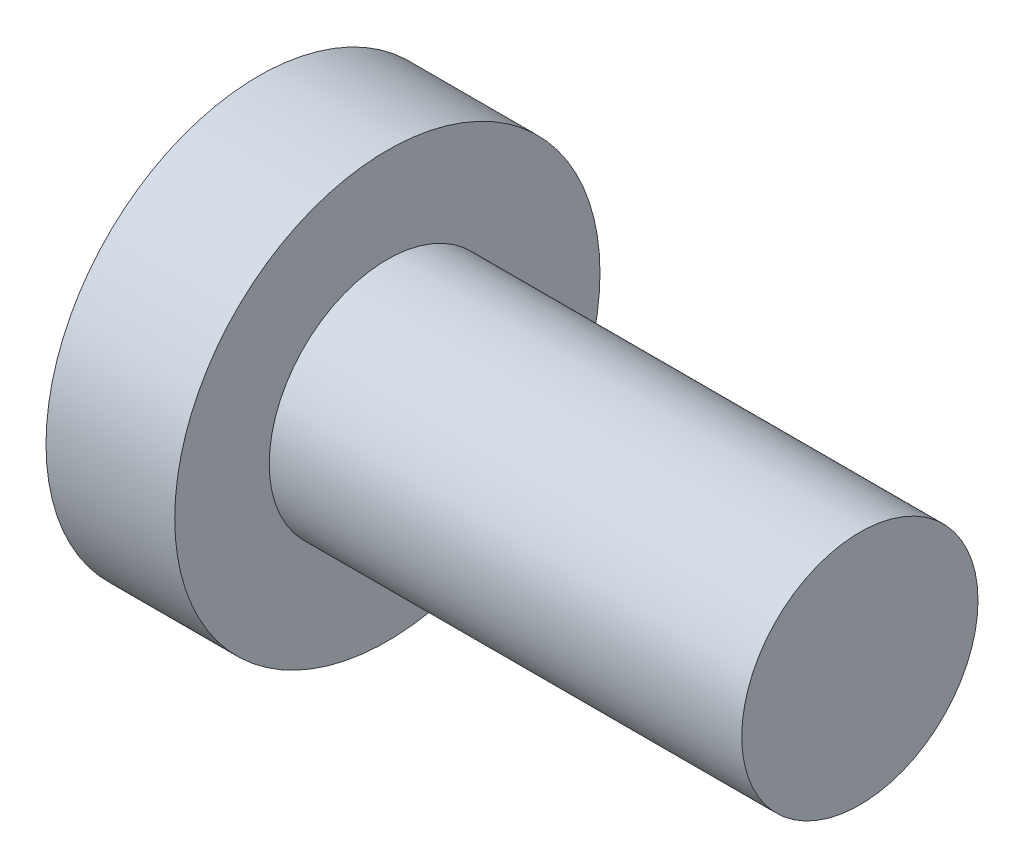
ISO-10303-21;
HEADER;
FILE_DESCRIPTION(('STEP AP214'),'2;1');
FILE_NAME('part.step','',(''),(''),'','','');
FILE_SCHEMA(('AUTOMOTIVE_DESIGN { 1 0 10303 214 1 1 1 1 }'));
ENDSEC;
DATA;
#1=APPLICATION_CONTEXT('core data for automotive mechanical design processes');
#2=APPLICATION_PROTOCOL_DEFINITION('international standard','automotive_design',2000,#1);
#3=PRODUCT_CONTEXT('',#1,'mechanical');
#4=PRODUCT('Part','Part','',(#3));
#5=PRODUCT_RELATED_PRODUCT_CATEGORY('part','',(#4));
#6=PRODUCT_DEFINITION_FORMATION('','',#4);
#7=PRODUCT_DEFINITION_CONTEXT('part definition',#1,'design');
#8=PRODUCT_DEFINITION('design','',#6,#7);
#9=PRODUCT_DEFINITION_SHAPE('','',#8);
#10=(LENGTH_UNIT() NAMED_UNIT(*) SI_UNIT(.MILLI.,.METRE.));
#11=(NAMED_UNIT(*) PLANE_ANGLE_UNIT() SI_UNIT($,.RADIAN.));
#12=(NAMED_UNIT(*) SI_UNIT($,.STERADIAN.) SOLID_ANGLE_UNIT());
#13=UNCERTAINTY_MEASURE_WITH_UNIT(LENGTH_MEASURE(1.E-05),#10,'distance_accuracy_value','');
#14=(GEOMETRIC_REPRESENTATION_CONTEXT(3) GLOBAL_UNCERTAINTY_ASSIGNED_CONTEXT((#13)) GLOBAL_UNIT_ASSIGNED_CONTEXT((#10,
#11,#12)) REPRESENTATION_CONTEXT('',''));
#15=CARTESIAN_POINT('',(0.,0.,0.));
#16=DIRECTION('',(0.,0.,1.));
#17=DIRECTION('',(1.,0.,0.));
#18=AXIS2_PLACEMENT_3D('',#15,#16,#17);
#19=CARTESIAN_POINT('',(0.,0.,1.3));
#20=DIRECTION('',(-0.500000000000001,0.,-0.866025403784438));
#21=DIRECTION('',(-0.866025403784438,0.,0.500000000000001));
#22=AXIS2_PLACEMENT_3D('',#19,#20,#21);
#23=PLANE('',#22);
#24=DIRECTION('',(0.866025403784438,0.,-0.5));
#25=VECTOR('',#24,1.);
#26=CARTESIAN_POINT('',(0.131900023728686,-0.26,1.22384748579412));
#27=LINE('',#26,#25);
#28=CARTESIAN_POINT('',(0.131900023728685,-0.260000000000001,1.22384748579413));
#29=VERTEX_POINT('',#28);
#30=CARTESIAN_POINT('',(1.28171759760097,-0.26,0.56));
#31=VERTEX_POINT('',#30);
#32=EDGE_CURVE('E153',#29,#31,#27,.T.);
#33=ORIENTED_EDGE('',*,*,#32,.F.);
#34=CARTESIAN_POINT('',(0.131900023728686,-0.260000000000001,1.22384748579413));
#35=CARTESIAN_POINT('',(0.128474523226237,-0.173333333333334,1.22582519943132));
#36=CARTESIAN_POINT('',(0.126761772975013,-0.0866666666666675,1.22681405624992));
#37=CARTESIAN_POINT('',(0.126761772975013,0.0866666666666658,1.22681405624992));
#38=CARTESIAN_POINT('',(0.128474523226237,0.173333333333333,1.22582519943132));
#39=CARTESIAN_POINT('',(0.131900023728686,0.259999999999999,1.22384748579413));
#40=B_SPLINE_CURVE_WITH_KNOTS('',3,(#34,#35,#36,#37,#38,#39),.UNSPECIFIED.,.F.,.F.,(4,2,4),(0.,
0.260067687652805,0.520135375305609),.UNSPECIFIED.);
#41=CARTESIAN_POINT('',(0.131900023728685,0.259999999999999,1.22384748579413));
#42=VERTEX_POINT('',#41);
#43=EDGE_CURVE('E137',#29,#42,#40,.T.);
#44=ORIENTED_EDGE('',*,*,#43,.T.);
#45=DIRECTION('',(-0.866025403784438,0.,0.5));
#46=VECTOR('',#45,1.);
#47=CARTESIAN_POINT('',(1.28171759760097,0.26,0.56));
#48=LINE('',#47,#46);
#49=CARTESIAN_POINT('',(1.28171759760097,0.26,0.56));
#50=VERTEX_POINT('',#49);
#51=EDGE_CURVE('E156',#50,#42,#48,.T.);
#52=ORIENTED_EDGE('',*,*,#51,.F.);
#53=CARTESIAN_POINT('',(1.28171759760097,0.56,0.56));
#54=DIRECTION('',(-0.500000000000001,0.,-0.866025403784438));
#55=DIRECTION('',(-0.866025403784438,0.,0.500000000000001));
#56=AXIS2_PLACEMENT_3D('',#53,#54,#55);
#57=ELLIPSE('',#56,0.599999999999999,0.3);
#58=CARTESIAN_POINT('',(1.42,0.270818409307259,0.48016261775073));
#59=VERTEX_POINT('',#58);
#60=EDGE_CURVE('E141',#59,#50,#57,.T.);
#61=ORIENTED_EDGE('',*,*,#60,.F.);
#62=DIRECTION('',(0.,1.,0.));
#63=VECTOR('',#62,1.);
#64=CARTESIAN_POINT('',(1.42,0.26,0.48016261775073));
#65=LINE('',#64,#63);
#66=CARTESIAN_POINT('',(1.42,-0.270818409307259,0.48016261775073));
#67=VERTEX_POINT('',#66);
#68=EDGE_CURVE('E139',#59,#67,#65,.F.);
#69=ORIENTED_EDGE('',*,*,#68,.T.);
#70=CARTESIAN_POINT('',(1.28171759760097,-0.56,0.559999999999999));
#71=DIRECTION('',(-0.500000000000001,0.,-0.866025403784438));
#72=DIRECTION('',(-0.866025403784438,0.,0.500000000000001));
#73=AXIS2_PLACEMENT_3D('',#70,#71,#72);
#74=ELLIPSE('',#73,0.599999999999999,0.3);
#75=EDGE_CURVE('E20',#67,#31,#74,.F.);
#76=ORIENTED_EDGE('',*,*,#75,.T.);
#77=EDGE_LOOP('',(#33,#44,#52,#61,#69,#76));
#78=FACE_BOUND('',#77,.T.);
#79=ADVANCED_FACE('F16',(#78),#23,.T.);
#80=CARTESIAN_POINT('',(0.,-1.3,0.));
#81=DIRECTION('',(-0.500000000000001,0.866025403784438,0.));
#82=DIRECTION('',(-0.866025403784438,-0.500000000000001,0.));
#83=AXIS2_PLACEMENT_3D('',#80,#81,#82);
#84=PLANE('',#83);
#85=DIRECTION('',(0.866025403784439,0.5,0.));
#86=VECTOR('',#85,1.);
#87=CARTESIAN_POINT('',(0.131900023728686,-1.22384748579412,-0.26));
#88=LINE('',#87,#86);
#89=CARTESIAN_POINT('',(0.131900023717085,-1.22384748580082,-0.259999999706629));
#90=VERTEX_POINT('',#89);
#91=CARTESIAN_POINT('',(1.28171759760097,-0.56,-0.26));
#92=VERTEX_POINT('',#91);
#93=EDGE_CURVE('E222',#90,#92,#88,.T.);
#94=ORIENTED_EDGE('',*,*,#93,.F.);
#95=CARTESIAN_POINT('',(0.131900023705483,-1.22384748580752,-0.259999999413259));
#96=CARTESIAN_POINT('',(0.128474523218503,-1.22582519943579,-0.173333332942172));
#97=CARTESIAN_POINT('',(0.126761772975013,-1.22681405624992,-0.0866666664710861));
#98=CARTESIAN_POINT('',(0.126761772975014,-1.22681405624992,0.0866666664710856));
#99=CARTESIAN_POINT('',(0.128474523218504,-1.22582519943579,0.173333332942171));
#100=CARTESIAN_POINT('',(0.131900023705484,-1.22384748580752,0.259999999413257));
#101=B_SPLINE_CURVE_WITH_KNOTS('',3,(#95,#96,#97,#98,#99,#100),.UNSPECIFIED.,.F.,.F.,(4,2,4),
(0.,0.260067687065605,0.520135374131208),.UNSPECIFIED.);
#102=CARTESIAN_POINT('',(0.131900023717085,-1.22384748580082,0.259999999706628));
#103=VERTEX_POINT('',#102);
#104=EDGE_CURVE('E380',#90,#103,#101,.T.);
#105=ORIENTED_EDGE('',*,*,#104,.T.);
#106=DIRECTION('',(-0.866025403784438,-0.5,0.));
#107=VECTOR('',#106,1.);
#108=CARTESIAN_POINT('',(1.28171759760097,-0.56,0.26));
#109=LINE('',#108,#107);
#110=CARTESIAN_POINT('',(1.28171759760097,-0.56,0.26));
#111=VERTEX_POINT('',#110);
#112=EDGE_CURVE('E226',#111,#103,#109,.T.);
#113=ORIENTED_EDGE('',*,*,#112,.F.);
#114=CARTESIAN_POINT('',(1.28171759760097,-0.56,0.559999999999999));
#115=DIRECTION('',(-0.500000000000001,0.866025403784438,0.));
#116=DIRECTION('',(-0.866025403784438,-0.500000000000001,0.));
#117=AXIS2_PLACEMENT_3D('',#114,#115,#116);
#118=ELLIPSE('',#117,0.599999999999999,0.3);
#119=CARTESIAN_POINT('',(1.42,-0.480162617750729,0.270818409307259));
#120=VERTEX_POINT('',#119);
#121=EDGE_CURVE('E152',#120,#111,#118,.T.);
#122=ORIENTED_EDGE('',*,*,#121,.F.);
#123=DIRECTION('',(0.,0.,-1.));
#124=VECTOR('',#123,1.);
#125=CARTESIAN_POINT('',(1.42,-0.480162617750729,0.26));
#126=LINE('',#125,#124);
#127=CARTESIAN_POINT('',(1.42,-0.480162617750729,-0.270818409307259));
#128=VERTEX_POINT('',#127);
#129=EDGE_CURVE('E150',#120,#128,#126,.T.);
#130=ORIENTED_EDGE('',*,*,#129,.T.);
#131=CARTESIAN_POINT('',(1.28171759760097,-0.56,-0.56));
#132=DIRECTION('',(-0.500000000000001,0.866025403784438,0.));
#133=DIRECTION('',(-0.866025403784438,-0.500000000000001,0.));
#134=AXIS2_PLACEMENT_3D('',#131,#132,#133);
#135=ELLIPSE('',#134,0.599999999999999,0.3);
#136=EDGE_CURVE('E370',#128,#92,#135,.F.);
#137=ORIENTED_EDGE('',*,*,#136,.T.);
#138=EDGE_LOOP('',(#94,#105,#113,#122,#130,#137));
#139=FACE_BOUND('',#138,.T.);
#140=ADVANCED_FACE('F384',(#139),#84,.T.);
#141=CARTESIAN_POINT('',(0.,0.,-1.3));
#142=DIRECTION('',(-0.500000000000001,0.,0.866025403784438));
#143=DIRECTION('',(0.866025403784438,0.,0.500000000000001));
#144=AXIS2_PLACEMENT_3D('',#141,#142,#143);
#145=PLANE('',#144);
#146=DIRECTION('',(0.866025403784438,0.,0.5));
#147=VECTOR('',#146,1.);
#148=CARTESIAN_POINT('',(0.131900023728686,0.26,-1.22384748579412));
#149=LINE('',#148,#147);
#150=CARTESIAN_POINT('',(0.131900023728686,0.260000000000001,-1.22384748579413));
#151=VERTEX_POINT('',#150);
#152=CARTESIAN_POINT('',(1.28171759760097,0.26,-0.56));
#153=VERTEX_POINT('',#152);
#154=EDGE_CURVE('E209',#151,#153,#149,.T.);
#155=ORIENTED_EDGE('',*,*,#154,.F.);
#156=CARTESIAN_POINT('',(0.131900023728686,0.260000000000001,-1.22384748579413));
#157=CARTESIAN_POINT('',(0.128474523226237,0.173333333333334,-1.22582519943132));
#158=CARTESIAN_POINT('',(0.126761772975012,0.0866666666666672,-1.22681405624992));
#159=CARTESIAN_POINT('',(0.126761772975013,-0.0866666666666662,-1.22681405624992));
#160=CARTESIAN_POINT('',(0.128474523226237,-0.173333333333333,-1.22582519943133));
#161=CARTESIAN_POINT('',(0.131900023728686,-0.26,-1.22384748579413));
#162=B_SPLINE_CURVE_WITH_KNOTS('',3,(#156,#157,#158,#159,#160,#161),.UNSPECIFIED.,.F.,.F.,(4,2,
4),(0.,0.260067687652805,0.520135375305609),.UNSPECIFIED.);
#163=CARTESIAN_POINT('',(0.131900023728687,-0.26,-1.22384748579413));
#164=VERTEX_POINT('',#163);
#165=EDGE_CURVE('E163',#151,#164,#162,.T.);
#166=ORIENTED_EDGE('',*,*,#165,.T.);
#167=DIRECTION('',(-0.866025403784438,0.,-0.5));
#168=VECTOR('',#167,1.);
#169=CARTESIAN_POINT('',(1.28171759760097,-0.26,-0.56));
#170=LINE('',#169,#168);
#171=CARTESIAN_POINT('',(1.28171759760097,-0.26,-0.56));
#172=VERTEX_POINT('',#171);
#173=EDGE_CURVE('E212',#172,#164,#170,.T.);
#174=ORIENTED_EDGE('',*,*,#173,.F.);
#175=CARTESIAN_POINT('',(1.28171759760097,-0.56,-0.56));
#176=DIRECTION('',(-0.500000000000001,0.,0.866025403784438));
#177=DIRECTION('',(-0.866025403784438,0.,-0.500000000000001));
#178=AXIS2_PLACEMENT_3D('',#175,#176,#177);
#179=ELLIPSE('',#178,0.599999999999999,0.3);
#180=CARTESIAN_POINT('',(1.42,-0.270818409307259,-0.48016261775073));
#181=VERTEX_POINT('',#180);
#182=EDGE_CURVE('E221',#181,#172,#179,.T.);
#183=ORIENTED_EDGE('',*,*,#182,.F.);
#184=DIRECTION('',(0.,1.,0.));
#185=VECTOR('',#184,1.);
#186=CARTESIAN_POINT('',(1.42,0.26,-0.48016261775073));
#187=LINE('',#186,#185);
#188=CARTESIAN_POINT('',(1.42,0.270818409307259,-0.48016261775073));
#189=VERTEX_POINT('',#188);
#190=EDGE_CURVE('E145',#181,#189,#187,.T.);
#191=ORIENTED_EDGE('',*,*,#190,.T.);
#192=CARTESIAN_POINT('',(1.28171759760097,0.56,-0.56));
#193=DIRECTION('',(-0.500000000000001,0.,0.866025403784438));
#194=DIRECTION('',(-0.866025403784438,0.,-0.500000000000001));
#195=AXIS2_PLACEMENT_3D('',#192,#193,#194);
#196=ELLIPSE('',#195,0.599999999999999,0.3);
#197=EDGE_CURVE('E171',#189,#153,#196,.F.);
#198=ORIENTED_EDGE('',*,*,#197,.T.);
#199=EDGE_LOOP('',(#155,#166,#174,#183,#191,#198));
#200=FACE_BOUND('',#199,.T.);
#201=ADVANCED_FACE('F173',(#200),#145,.T.);
#202=CARTESIAN_POINT('',(1.42,0.26,0.26));
#203=DIRECTION('',(1.,0.,0.));
#204=DIRECTION('',(0.,0.,-1.));
#205=AXIS2_PLACEMENT_3D('',#202,#203,#204);
#206=PLANE('',#205);
#207=CARTESIAN_POINT('',(1.42,0.56,0.56));
#208=DIRECTION('',(-1.,0.,0.));
#209=DIRECTION('',(0.,0.,1.));
#210=AXIS2_PLACEMENT_3D('',#207,#208,#209);
#211=CIRCLE('',#210,0.3);
#212=CARTESIAN_POINT('',(1.42,0.480162617750729,0.270818409307259));
#213=VERTEX_POINT('',#212);
#214=EDGE_CURVE('E144',#213,#59,#211,.T.);
#215=ORIENTED_EDGE('',*,*,#214,.F.);
#216=DIRECTION('',(0.,0.,1.));
#217=VECTOR('',#216,1.);
#218=CARTESIAN_POINT('',(1.42,0.480162617750729,0.));
#219=LINE('',#218,#217);
#220=CARTESIAN_POINT('',(1.42,0.480162617750729,-0.270818409307259));
#221=VERTEX_POINT('',#220);
#222=EDGE_CURVE('E198',#221,#213,#219,.T.);
#223=ORIENTED_EDGE('',*,*,#222,.F.);
#224=CARTESIAN_POINT('',(1.42,0.56,-0.56));
#225=DIRECTION('',(-1.,0.,0.));
#226=DIRECTION('',(0.,0.,1.));
#227=AXIS2_PLACEMENT_3D('',#224,#225,#226);
#228=CIRCLE('',#227,0.3);
#229=EDGE_CURVE('E208',#189,#221,#228,.T.);
#230=ORIENTED_EDGE('',*,*,#229,.F.);
#231=ORIENTED_EDGE('',*,*,#190,.F.);
#232=CARTESIAN_POINT('',(1.42,-0.56,-0.56));
#233=DIRECTION('',(-1.,0.,0.));
#234=DIRECTION('',(0.,0.,1.));
#235=AXIS2_PLACEMENT_3D('',#232,#233,#234);
#236=CIRCLE('',#235,0.3);
#237=EDGE_CURVE('E225',#128,#181,#236,.T.);
#238=ORIENTED_EDGE('',*,*,#237,.F.);
#239=ORIENTED_EDGE('',*,*,#129,.F.);
#240=CARTESIAN_POINT('',(1.42,-0.56,0.559999999999999));
#241=DIRECTION('',(-1.,0.,0.));
#242=DIRECTION('',(0.,0.,1.));
#243=AXIS2_PLACEMENT_3D('',#240,#241,#242);
#244=CIRCLE('',#243,0.3);
#245=EDGE_CURVE('E131',#67,#120,#244,.T.);
#246=ORIENTED_EDGE('',*,*,#245,.F.);
#247=ORIENTED_EDGE('',*,*,#68,.F.);
#248=EDGE_LOOP('',(#215,#223,#230,#231,#238,#239,#246,#247));
#249=FACE_BOUND('',#248,.T.);
#250=ADVANCED_FACE('F147',(#249),#206,.F.);
#251=CARTESIAN_POINT('',(1.42,0.26,0.26));
#252=DIRECTION('',(0.,0.,-1.));
#253=DIRECTION('',(0.,1.,0.));
#254=AXIS2_PLACEMENT_3D('',#251,#252,#253);
#255=PLANE('',#254);
#256=DIRECTION('',(-1.,0.,0.));
#257=VECTOR('',#256,1.);
#258=CARTESIAN_POINT('',(1.42,0.56,0.26));
#259=LINE('',#258,#257);
#260=CARTESIAN_POINT('',(0.0318512082891233,0.56,0.26));
#261=VERTEX_POINT('',#260);
#262=CARTESIAN_POINT('',(1.28171759760097,0.56,0.26));
#263=VERTEX_POINT('',#262);
#264=EDGE_CURVE('E161',#261,#263,#259,.F.);
#265=ORIENTED_EDGE('',*,*,#264,.F.);
#266=CARTESIAN_POINT('',(0.131900023728999,1.22384748579563,0.26));
#267=CARTESIAN_POINT('',(0.109024671869535,1.11414072631645,0.26));
#268=CARTESIAN_POINT('',(0.0892495946531461,1.00396672276055,0.26));
#269=CARTESIAN_POINT('',(0.0558999895065205,0.782684227495345,0.26));
#270=CARTESIAN_POINT('',(0.0423254615762836,0.671575735786029,0.26));
#271=CARTESIAN_POINT('',(0.0318512082891225,0.56,0.26));
#272=B_SPLINE_CURVE_WITH_KNOTS('',3,(#266,#267,#268,#269,#270,#271),.UNSPECIFIED.,.F.,.F.,(4,2,
4),(0.,0.335803934828096,0.671607869656192),.UNSPECIFIED.);
#273=CARTESIAN_POINT('',(0.131900023728843,1.22384748579488,0.26));
#274=VERTEX_POINT('',#273);
#275=EDGE_CURVE('E196',#274,#261,#272,.T.);
#276=ORIENTED_EDGE('',*,*,#275,.F.);
#277=DIRECTION('',(0.866025403784438,-0.500000000000001,0.));
#278=VECTOR('',#277,1.);
#279=CARTESIAN_POINT('',(0.,1.3,0.26));
#280=LINE('',#279,#278);
#281=EDGE_CURVE('E193',#263,#274,#280,.F.);
#282=ORIENTED_EDGE('',*,*,#281,.F.);
#283=EDGE_LOOP('',(#265,#276,#282));
#284=FACE_BOUND('',#283,.T.);
#285=ADVANCED_FACE('F343',(#284),#255,.T.);
#286=CARTESIAN_POINT('',(1.42,0.56,0.56));
#287=DIRECTION('',(-1.,0.,0.));
#288=DIRECTION('',(0.,0.,1.));
#289=AXIS2_PLACEMENT_3D('',#286,#287,#288);
#290=CYLINDRICAL_SURFACE('',#289,0.3);
#291=ORIENTED_EDGE('',*,*,#264,.T.);
#292=CARTESIAN_POINT('',(1.28171759760097,0.56,0.56));
#293=DIRECTION('',(-0.500000000000001,-0.866025403784438,0.));
#294=DIRECTION('',(-0.866025403784438,0.500000000000001,0.));
#295=AXIS2_PLACEMENT_3D('',#292,#293,#294);
#296=ELLIPSE('',#295,0.599999999999999,0.3);
#297=EDGE_CURVE('E197',#213,#263,#296,.F.);
#298=ORIENTED_EDGE('',*,*,#297,.F.);
#299=ORIENTED_EDGE('',*,*,#214,.T.);
#300=ORIENTED_EDGE('',*,*,#60,.T.);
#301=DIRECTION('',(1.,0.,0.));
#302=VECTOR('',#301,1.);
#303=CARTESIAN_POINT('',(1.42,0.26,0.56));
#304=LINE('',#303,#302);
#305=CARTESIAN_POINT('',(0.0318512082891228,0.26,0.56));
#306=VERTEX_POINT('',#305);
#307=EDGE_CURVE('E235',#306,#50,#304,.T.);
#308=ORIENTED_EDGE('',*,*,#307,.F.);
#309=CARTESIAN_POINT('',(0.0318512082891225,0.56,0.26));
#310=CARTESIAN_POINT('',(0.0302763429254548,0.543230502681691,0.259985437714721));
#311=CARTESIAN_POINT('',(0.0288356986059309,0.526450523314333,0.261405308271578));
#312=CARTESIAN_POINT('',(0.0262583139029484,0.493346825657173,0.267021001154307));
#313=CARTESIAN_POINT('',(0.0251214084487592,0.477022863876044,0.271215311349898));
#314=CARTESIAN_POINT('',(0.0231845218660754,0.445278479801574,0.282290873833725));
#315=CARTESIAN_POINT('',(0.0223847676736678,0.429858672084473,0.289173929928476));
#316=CARTESIAN_POINT('',(0.0211465173921949,0.400382770095474,0.305431001307788));
#317=CARTESIAN_POINT('',(0.0207079245575508,0.386326311509045,0.314804348618755));
#318=CARTESIAN_POINT('',(0.0202059114511675,0.36004075309326,0.335729534202575));
#319=CARTESIAN_POINT('',(0.0201407552432185,0.347803456016402,0.347271034522211));
#320=CARTESIAN_POINT('',(0.0203828825863919,0.325427901409002,0.372232049117524));
#321=CARTESIAN_POINT('',(0.0206901591607611,0.315289604562224,0.38565152820901));
#322=CARTESIAN_POINT('',(0.0216670469531175,0.297415154250282,0.413955683439772));
#323=CARTESIAN_POINT('',(0.0223359776383337,0.289674531920633,0.428837564843834));
#324=CARTESIAN_POINT('',(0.0240164089167484,0.276784108973221,0.459663052830639));
#325=CARTESIAN_POINT('',(0.0250277553585772,0.271633145111392,0.475606179063786));
#326=CARTESIAN_POINT('',(0.0269984817654867,0.265235606144538,0.503026452257885));
#327=CARTESIAN_POINT('',(0.0278759321019495,0.263272642846243,0.514347905971935));
#328=CARTESIAN_POINT('',(0.0297654658761743,0.260654830519488,0.537113472785311));
#329=CARTESIAN_POINT('',(0.0307773551688136,0.2599981165591,0.54855738752774));
#330=CARTESIAN_POINT('',(0.0318512082891224,0.259999999999999,0.56));
#331=B_SPLINE_CURVE_WITH_KNOTS('',3,(#309,#310,#311,#312,#313,#314,#315,#316,#317,#318,#319,
#320,#321,#322,#323,#324,#325,#326,#327,#328,#329,#330),.UNSPECIFIED.,.F.,.F.,(4,2,2,2,2,2,2,2,
2,2,4),(0.,0.0504666310904526,0.10090577940126,0.151378824240234,0.201838344282696,
0.252063109630029,0.302286934135435,0.35241657860075,0.402523685256848,0.43702381806311,
0.471474659580351),.UNSPECIFIED.);
#332=EDGE_CURVE('E347',#261,#306,#331,.T.);
#333=ORIENTED_EDGE('',*,*,#332,.F.);
#334=EDGE_LOOP('',(#291,#298,#299,#300,#308,#333));
#335=FACE_BOUND('',#334,.T.);
#336=ADVANCED_FACE('F338',(#335),#290,.T.);
#337=CARTESIAN_POINT('',(1.42,0.26,0.26));
#338=DIRECTION('',(0.,-1.,0.));
#339=DIRECTION('',(0.,0.,-1.));
#340=AXIS2_PLACEMENT_3D('',#337,#338,#339);
#341=PLANE('',#340);
#342=ORIENTED_EDGE('',*,*,#307,.T.);
#343=ORIENTED_EDGE('',*,*,#51,.T.);
#344=CARTESIAN_POINT('',(6.,0.260000000000001,0.));
#345=DIRECTION('',(0.,1.,0.));
#346=DIRECTION('',(0.,0.,1.));
#347=AXIS2_PLACEMENT_3D('',#344,#345,#346);
#348=CIRCLE('',#347,5.99436401964379);
#349=EDGE_CURVE('E355',#306,#42,#348,.T.);
#350=ORIENTED_EDGE('',*,*,#349,.F.);
#351=EDGE_LOOP('',(#342,#343,#350));
#352=FACE_BOUND('',#351,.T.);
#353=ADVANCED_FACE('F334',(#352),#341,.T.);
#354=CARTESIAN_POINT('',(1.42,-0.26,0.26));
#355=DIRECTION('',(0.,1.,0.));
#356=DIRECTION('',(0.,0.,1.));
#357=AXIS2_PLACEMENT_3D('',#354,#355,#356);
#358=PLANE('',#357);
#359=DIRECTION('',(-1.,0.,0.));
#360=VECTOR('',#359,1.);
#361=CARTESIAN_POINT('',(1.42,-0.26,0.56));
#362=LINE('',#361,#360);
#363=CARTESIAN_POINT('',(0.0318512082891224,-0.26,0.56));
#364=VERTEX_POINT('',#363);
#365=EDGE_CURVE('E133',#364,#31,#362,.F.);
#366=ORIENTED_EDGE('',*,*,#365,.F.);
#367=CARTESIAN_POINT('',(6.,-0.260000000000001,0.));
#368=DIRECTION('',(0.,1.,0.));
#369=DIRECTION('',(0.,0.,1.));
#370=AXIS2_PLACEMENT_3D('',#367,#368,#369);
#371=CIRCLE('',#370,5.99436401964379);
#372=EDGE_CURVE('E611',#29,#364,#371,.F.);
#373=ORIENTED_EDGE('',*,*,#372,.F.);
#374=ORIENTED_EDGE('',*,*,#32,.T.);
#375=EDGE_LOOP('',(#366,#373,#374));
#376=FACE_BOUND('',#375,.T.);
#377=ADVANCED_FACE('F331',(#376),#358,.T.);
#378=CARTESIAN_POINT('',(1.42,-0.56,0.559999999999999));
#379=DIRECTION('',(-1.,0.,0.));
#380=DIRECTION('',(0.,0.,1.));
#381=AXIS2_PLACEMENT_3D('',#378,#379,#380);
#382=CYLINDRICAL_SURFACE('',#381,0.3);
#383=ORIENTED_EDGE('',*,*,#365,.T.);
#384=ORIENTED_EDGE('',*,*,#75,.F.);
#385=ORIENTED_EDGE('',*,*,#245,.T.);
#386=ORIENTED_EDGE('',*,*,#121,.T.);
#387=DIRECTION('',(1.,0.,0.));
#388=VECTOR('',#387,1.);
#389=CARTESIAN_POINT('',(1.42,-0.56,0.26));
#390=LINE('',#389,#388);
#391=CARTESIAN_POINT('',(0.0318512082891233,-0.56,0.26));
#392=VERTEX_POINT('',#391);
#393=EDGE_CURVE('E229',#392,#111,#390,.T.);
#394=ORIENTED_EDGE('',*,*,#393,.F.);
#395=CARTESIAN_POINT('',(0.0318512082891224,-0.259999999999999,0.56));
#396=CARTESIAN_POINT('',(0.0302763429254535,-0.259985437714721,0.54323050268169));
#397=CARTESIAN_POINT('',(0.0288356986059302,-0.261405308271578,0.526450523314333));
#398=CARTESIAN_POINT('',(0.0262583139029492,-0.267021001154307,0.493346825657173));
#399=CARTESIAN_POINT('',(0.0251214084487609,-0.271215311349898,0.477022863876044));
#400=CARTESIAN_POINT('',(0.0231845218660765,-0.282290873833725,0.445278479801575));
#401=CARTESIAN_POINT('',(0.0223847676736673,-0.289173929928476,0.429858672084474));
#402=CARTESIAN_POINT('',(0.0211465173921935,-0.305431001307788,0.400382770095475));
#403=CARTESIAN_POINT('',(0.0207079245575501,-0.314804348618754,0.386326311509045));
#404=CARTESIAN_POINT('',(0.020205911451168,-0.335729534202574,0.36004075309326));
#405=CARTESIAN_POINT('',(0.0201407552432196,-0.347271034522211,0.347803456016403));
#406=CARTESIAN_POINT('',(0.0203828825863926,-0.372232049117523,0.325427901409003));
#407=CARTESIAN_POINT('',(0.020690159160761,-0.385651528209009,0.315289604562225));
#408=CARTESIAN_POINT('',(0.0216670469531166,-0.413955683439771,0.297415154250282));
#409=CARTESIAN_POINT('',(0.0223359776383329,-0.428837564843833,0.289674531920634));
#410=CARTESIAN_POINT('',(0.0240164089167474,-0.459663052830637,0.276784108973221));
#411=CARTESIAN_POINT('',(0.0250277553585759,-0.475606179063785,0.271633145111392));
#412=CARTESIAN_POINT('',(0.0269984817654858,-0.503026452257883,0.265235606144538));
#413=CARTESIAN_POINT('',(0.0278759321019491,-0.514347905971934,0.263272642846243));
#414=CARTESIAN_POINT('',(0.0297654658761745,-0.53711347278531,0.260654830519488));
#415=CARTESIAN_POINT('',(0.030777355168814,-0.54855738752774,0.2599981165591));
#416=CARTESIAN_POINT('',(0.0318512082891225,-0.560000000000001,0.26));
#417=B_SPLINE_CURVE_WITH_KNOTS('',3,(#395,#396,#397,#398,#399,#400,#401,#402,#403,#404,#405,
#406,#407,#408,#409,#410,#411,#412,#413,#414,#415,#416),.UNSPECIFIED.,.F.,.F.,(4,2,2,2,2,2,2,2,
2,2,4),(0.,0.0504666310904519,0.100905779401259,0.151378824240232,0.201838344282695,
0.252063109630027,0.302286934135432,0.352416578600748,0.402523685256845,0.437023818063109,
0.471474659580351),.UNSPECIFIED.);
#418=EDGE_CURVE('E317',#364,#392,#417,.T.);
#419=ORIENTED_EDGE('',*,*,#418,.F.);
#420=EDGE_LOOP('',(#383,#384,#385,#386,#394,#419));
#421=FACE_BOUND('',#420,.T.);
#422=ADVANCED_FACE('F129',(#421),#382,.T.);
#423=CARTESIAN_POINT('',(1.42,-0.26,0.26));
#424=DIRECTION('',(0.,0.,-1.));
#425=DIRECTION('',(0.,1.,0.));
#426=AXIS2_PLACEMENT_3D('',#423,#424,#425);
#427=PLANE('',#426);
#428=ORIENTED_EDGE('',*,*,#393,.T.);
#429=ORIENTED_EDGE('',*,*,#112,.T.);
#430=CARTESIAN_POINT('',(0.0318512082891225,-0.560000000000001,0.26));
#431=CARTESIAN_POINT('',(0.0423254615762838,-0.671575735786029,0.26));
#432=CARTESIAN_POINT('',(0.0558999895065207,-0.782684227495345,0.26));
#433=CARTESIAN_POINT('',(0.089249594653146,-1.00396672276055,0.26));
#434=CARTESIAN_POINT('',(0.109024671869534,-1.11414072631645,0.26));
#435=CARTESIAN_POINT('',(0.131900023728998,-1.22384748579563,0.26));
#436=B_SPLINE_CURVE_WITH_KNOTS('',3,(#430,#431,#432,#433,#434,#435),.UNSPECIFIED.,.F.,.F.,(4,2,
4),(0.,0.335803934828095,0.67160786965619),.UNSPECIFIED.);
#437=EDGE_CURVE('E310',#392,#103,#436,.T.);
#438=ORIENTED_EDGE('',*,*,#437,.F.);
#439=EDGE_LOOP('',(#428,#429,#438));
#440=FACE_BOUND('',#439,.T.);
#441=ADVANCED_FACE('F324',(#440),#427,.T.);
#442=CARTESIAN_POINT('',(1.42,-0.26,-0.26));
#443=DIRECTION('',(0.,0.,1.));
#444=DIRECTION('',(1.,0.,0.));
#445=AXIS2_PLACEMENT_3D('',#442,#443,#444);
#446=PLANE('',#445);
#447=DIRECTION('',(-1.,0.,0.));
#448=VECTOR('',#447,1.);
#449=CARTESIAN_POINT('',(1.42,-0.56,-0.26));
#450=LINE('',#449,#448);
#451=CARTESIAN_POINT('',(0.0318512082891236,-0.56,-0.260000000000002));
#452=VERTEX_POINT('',#451);
#453=EDGE_CURVE('E218',#452,#92,#450,.F.);
#454=ORIENTED_EDGE('',*,*,#453,.F.);
#455=CARTESIAN_POINT('',(0.131900023728999,-1.22384748579563,-0.260000000000001));
#456=CARTESIAN_POINT('',(0.109024671869535,-1.11414072631645,-0.260000000000001));
#457=CARTESIAN_POINT('',(0.089249594653146,-1.00396672276055,-0.26));
#458=CARTESIAN_POINT('',(0.0558999895065207,-0.782684227495345,-0.26));
#459=CARTESIAN_POINT('',(0.042325461576284,-0.671575735786029,-0.260000000000001));
#460=CARTESIAN_POINT('',(0.0318512082891232,-0.560000000000001,-0.260000000000002));
#461=B_SPLINE_CURVE_WITH_KNOTS('',3,(#455,#456,#457,#458,#459,#460),.UNSPECIFIED.,.F.,.F.,(4,2,
4),(0.,0.335803934828095,0.67160786965619),.UNSPECIFIED.);
#462=EDGE_CURVE('E303',#90,#452,#461,.T.);
#463=ORIENTED_EDGE('',*,*,#462,.F.);
#464=ORIENTED_EDGE('',*,*,#93,.T.);
#465=EDGE_LOOP('',(#454,#463,#464));
#466=FACE_BOUND('',#465,.T.);
#467=ADVANCED_FACE('F289',(#466),#446,.T.);
#468=CARTESIAN_POINT('',(1.42,-0.56,-0.56));
#469=DIRECTION('',(-1.,0.,0.));
#470=DIRECTION('',(0.,0.,1.));
#471=AXIS2_PLACEMENT_3D('',#468,#469,#470);
#472=CYLINDRICAL_SURFACE('',#471,0.3);
#473=ORIENTED_EDGE('',*,*,#453,.T.);
#474=ORIENTED_EDGE('',*,*,#136,.F.);
#475=ORIENTED_EDGE('',*,*,#237,.T.);
#476=ORIENTED_EDGE('',*,*,#182,.T.);
#477=DIRECTION('',(1.,0.,0.));
#478=VECTOR('',#477,1.);
#479=CARTESIAN_POINT('',(1.42,-0.26,-0.56));
#480=LINE('',#479,#478);
#481=CARTESIAN_POINT('',(0.0318512082891241,-0.26,-0.56));
#482=VERTEX_POINT('',#481);
#483=EDGE_CURVE('E215',#482,#172,#480,.T.);
#484=ORIENTED_EDGE('',*,*,#483,.F.);
#485=CARTESIAN_POINT('',(0.0318512082891232,-0.560000000000001,-0.260000000000003));
#486=CARTESIAN_POINT('',(0.0302763429254549,-0.543230502681691,-0.259985437714722));
#487=CARTESIAN_POINT('',(0.0288356986059309,-0.526450523314333,-0.261405308271578));
#488=CARTESIAN_POINT('',(0.0262583139029484,-0.493346825657173,-0.267021001154307));
#489=CARTESIAN_POINT('',(0.0251214084487592,-0.477022863876044,-0.271215311349899));
#490=CARTESIAN_POINT('',(0.0231845218660753,-0.445278479801574,-0.282290873833725));
#491=CARTESIAN_POINT('',(0.0223847676736677,-0.429858672084472,-0.289173929928477));
#492=CARTESIAN_POINT('',(0.0211465173921947,-0.400382770095473,-0.305431001307789));
#493=CARTESIAN_POINT('',(0.0207079245575508,-0.386326311509044,-0.314804348618757));
#494=CARTESIAN_POINT('',(0.0202059114511675,-0.360040753093259,-0.335729534202578));
#495=CARTESIAN_POINT('',(0.0201407552432185,-0.347803456016401,-0.347271034522214));
#496=CARTESIAN_POINT('',(0.0203828825863919,-0.325427901409001,-0.372232049117525));
#497=CARTESIAN_POINT('',(0.0206901591607611,-0.315289604562223,-0.385651528209011));
#498=CARTESIAN_POINT('',(0.0216670469531175,-0.297415154250281,-0.413955683439772));
#499=CARTESIAN_POINT('',(0.0223359776383337,-0.289674531920633,-0.428837564843835));
#500=CARTESIAN_POINT('',(0.0240164089167485,-0.276784108973221,-0.459663052830639));
#501=CARTESIAN_POINT('',(0.0250277553585773,-0.271633145111392,-0.475606179063787));
#502=CARTESIAN_POINT('',(0.0269984817654867,-0.265235606144538,-0.503026452257886));
#503=CARTESIAN_POINT('',(0.0278759321019494,-0.263272642846243,-0.514347905971937));
#504=CARTESIAN_POINT('',(0.0297654658761742,-0.260654830519488,-0.537113472785313));
#505=CARTESIAN_POINT('',(0.0307773551688137,-0.2599981165591,-0.548557387527743));
#506=CARTESIAN_POINT('',(0.0318512082891231,-0.26,-0.560000000000003));
#507=B_SPLINE_CURVE_WITH_KNOTS('',3,(#485,#486,#487,#488,#489,#490,#491,#492,#493,#494,#495,
#496,#497,#498,#499,#500,#501,#502,#503,#504,#505,#506),.UNSPECIFIED.,.F.,.F.,(4,2,2,2,2,2,2,2,
2,2,4),(0.,0.050466631090453,0.10090577940126,0.151378824240235,0.201838344282699,
0.252063109630031,0.302286934135435,0.35241657860075,0.402523685256848,0.437023818063112,
0.471474659580354),.UNSPECIFIED.);
#508=EDGE_CURVE('E294',#452,#482,#507,.T.);
#509=ORIENTED_EDGE('',*,*,#508,.F.);
#510=EDGE_LOOP('',(#473,#474,#475,#476,#484,#509));
#511=FACE_BOUND('',#510,.T.);
#512=ADVANCED_FACE('F284',(#511),#472,.T.);
#513=CARTESIAN_POINT('',(1.42,-0.26,-0.26));
#514=DIRECTION('',(0.,1.,0.));
#515=DIRECTION('',(0.,0.,1.));
#516=AXIS2_PLACEMENT_3D('',#513,#514,#515);
#517=PLANE('',#516);
#518=ORIENTED_EDGE('',*,*,#483,.T.);
#519=ORIENTED_EDGE('',*,*,#173,.T.);
#520=CARTESIAN_POINT('',(6.,-0.26,0.));
#521=DIRECTION('',(0.,1.,0.));
#522=DIRECTION('',(0.,0.,1.));
#523=AXIS2_PLACEMENT_3D('',#520,#521,#522);
#524=CIRCLE('',#523,5.99436401964379);
#525=EDGE_CURVE('E302',#482,#164,#524,.F.);
#526=ORIENTED_EDGE('',*,*,#525,.F.);
#527=EDGE_LOOP('',(#518,#519,#526));
#528=FACE_BOUND('',#527,.T.);
#529=ADVANCED_FACE('F280',(#528),#517,.T.);
#530=CARTESIAN_POINT('',(1.42,0.26,-0.26));
#531=DIRECTION('',(0.,-1.,0.));
#532=DIRECTION('',(0.,0.,-1.));
#533=AXIS2_PLACEMENT_3D('',#530,#531,#532);
#534=PLANE('',#533);
#535=DIRECTION('',(-1.,0.,0.));
#536=VECTOR('',#535,1.);
#537=CARTESIAN_POINT('',(1.42,0.26,-0.56));
#538=LINE('',#537,#536);
#539=CARTESIAN_POINT('',(0.0318512082891236,0.26,-0.560000000000002));
#540=VERTEX_POINT('',#539);
#541=EDGE_CURVE('E205',#540,#153,#538,.F.);
#542=ORIENTED_EDGE('',*,*,#541,.F.);
#543=CARTESIAN_POINT('',(6.,0.260000000000001,0.));
#544=DIRECTION('',(0.,1.,0.));
#545=DIRECTION('',(0.,0.,1.));
#546=AXIS2_PLACEMENT_3D('',#543,#544,#545);
#547=CIRCLE('',#546,5.99436401964379);
#548=EDGE_CURVE('E610',#151,#540,#547,.T.);
#549=ORIENTED_EDGE('',*,*,#548,.F.);
#550=ORIENTED_EDGE('',*,*,#154,.T.);
#551=EDGE_LOOP('',(#542,#549,#550));
#552=FACE_BOUND('',#551,.T.);
#553=ADVANCED_FACE('F276',(#552),#534,.T.);
#554=CARTESIAN_POINT('',(1.42,0.56,-0.56));
#555=DIRECTION('',(-1.,0.,0.));
#556=DIRECTION('',(0.,0.,1.));
#557=AXIS2_PLACEMENT_3D('',#554,#555,#556);
#558=CYLINDRICAL_SURFACE('',#557,0.3);
#559=ORIENTED_EDGE('',*,*,#541,.T.);
#560=ORIENTED_EDGE('',*,*,#197,.F.);
#561=ORIENTED_EDGE('',*,*,#229,.T.);
#562=CARTESIAN_POINT('',(1.28171759760097,0.56,-0.56));
#563=DIRECTION('',(-0.500000000000001,-0.866025403784438,0.));
#564=DIRECTION('',(-0.866025403784438,0.500000000000001,0.));
#565=AXIS2_PLACEMENT_3D('',#562,#563,#564);
#566=ELLIPSE('',#565,0.599999999999999,0.3);
#567=CARTESIAN_POINT('',(1.28171759760097,0.56,-0.26));
#568=VERTEX_POINT('',#567);
#569=EDGE_CURVE('E201',#568,#221,#566,.F.);
#570=ORIENTED_EDGE('',*,*,#569,.F.);
#571=DIRECTION('',(1.,0.,0.));
#572=VECTOR('',#571,1.);
#573=CARTESIAN_POINT('',(1.42,0.56,-0.26));
#574=LINE('',#573,#572);
#575=CARTESIAN_POINT('',(0.0318512082891232,0.56,-0.260000000000002));
#576=VERTEX_POINT('',#575);
#577=EDGE_CURVE('E203',#576,#568,#574,.T.);
#578=ORIENTED_EDGE('',*,*,#577,.F.);
#579=CARTESIAN_POINT('',(0.0318512082891231,0.260000000000001,-0.560000000000003));
#580=CARTESIAN_POINT('',(0.0302763429254538,0.259985437714722,-0.543230502681694));
#581=CARTESIAN_POINT('',(0.0288356986059303,0.261405308271578,-0.526450523314336));
#582=CARTESIAN_POINT('',(0.0262583139029492,0.267021001154306,-0.493346825657175));
#583=CARTESIAN_POINT('',(0.0251214084487609,0.271215311349896,-0.477022863876046));
#584=CARTESIAN_POINT('',(0.0231845218660765,0.282290873833723,-0.445278479801577));
#585=CARTESIAN_POINT('',(0.0223847676736673,0.289173929928475,-0.429858672084476));
#586=CARTESIAN_POINT('',(0.0211465173921936,0.305431001307787,-0.400382770095477));
#587=CARTESIAN_POINT('',(0.0207079245575503,0.314804348618752,-0.386326311509047));
#588=CARTESIAN_POINT('',(0.0202059114511678,0.335729534202572,-0.360040753093262));
#589=CARTESIAN_POINT('',(0.0201407552432189,0.34727103452221,-0.347803456016405));
#590=CARTESIAN_POINT('',(0.0203828825863919,0.372232049117522,-0.325427901409004));
#591=CARTESIAN_POINT('',(0.0206901591607607,0.385651528209007,-0.315289604562224));
#592=CARTESIAN_POINT('',(0.0216670469531168,0.413955683439769,-0.297415154250282));
#593=CARTESIAN_POINT('',(0.022335977638333,0.428837564843831,-0.289674531920634));
#594=CARTESIAN_POINT('',(0.0240164089167475,0.459663052830635,-0.276784108973223));
#595=CARTESIAN_POINT('',(0.025027755358576,0.475606179063782,-0.271633145111395));
#596=CARTESIAN_POINT('',(0.0269984817654858,0.503026452257881,-0.26523560614454));
#597=CARTESIAN_POINT('',(0.027875932101949,0.514347905971932,-0.263272642846244));
#598=CARTESIAN_POINT('',(0.0297654658761745,0.537113472785308,-0.260654830519489));
#599=CARTESIAN_POINT('',(0.0307773551688142,0.548557387527738,-0.259998116559101));
#600=CARTESIAN_POINT('',(0.0318512082891232,0.559999999999999,-0.260000000000002));
#601=B_SPLINE_CURVE_WITH_KNOTS('',3,(#579,#580,#581,#582,#583,#584,#585,#586,#587,#588,#589,
#590,#591,#592,#593,#594,#595,#596,#597,#598,#599,#600),.UNSPECIFIED.,.F.,.F.,(4,2,2,2,2,2,2,2,
2,2,4),(0.,0.050466631090453,0.10090577940126,0.151378824240233,0.201838344282696,
0.252063109630029,0.302286934135435,0.352416578600749,0.402523685256845,0.43702381806311,
0.471474659580353),.UNSPECIFIED.);
#602=EDGE_CURVE('E262',#540,#576,#601,.T.);
#603=ORIENTED_EDGE('',*,*,#602,.F.);
#604=EDGE_LOOP('',(#559,#560,#561,#570,#578,#603));
#605=FACE_BOUND('',#604,.T.);
#606=ADVANCED_FACE('F272',(#605),#558,.T.);
#607=CARTESIAN_POINT('',(1.42,0.26,-0.26));
#608=DIRECTION('',(0.,0.,1.));
#609=DIRECTION('',(1.,0.,0.));
#610=AXIS2_PLACEMENT_3D('',#607,#608,#609);
#611=PLANE('',#610);
#612=ORIENTED_EDGE('',*,*,#577,.T.);
#613=DIRECTION('',(0.866025403784438,-0.500000000000001,0.));
#614=VECTOR('',#613,1.);
#615=CARTESIAN_POINT('',(0.,1.3,-0.26));
#616=LINE('',#615,#614);
#617=CARTESIAN_POINT('',(0.131900023728885,1.22384748579401,-0.260000000005041));
#618=VERTEX_POINT('',#617);
#619=EDGE_CURVE('E35',#618,#568,#616,.T.);
#620=ORIENTED_EDGE('',*,*,#619,.F.);
#621=CARTESIAN_POINT('',(0.0318512082891232,0.56,-0.260000000000003));
#622=CARTESIAN_POINT('',(0.0423254615668712,0.671575735685899,-0.260000000000002));
#623=CARTESIAN_POINT('',(0.0558999894821671,0.782684227296078,-0.260000000000001));
#624=CARTESIAN_POINT('',(0.0892495945878544,1.003966722365,-0.26));
#625=CARTESIAN_POINT('',(0.109024671778246,1.11414072582374,-0.26));
#626=CARTESIAN_POINT('',(0.131900023606185,1.22384748520676,-0.260000000000001));
#627=B_SPLINE_CURVE_WITH_KNOTS('',3,(#621,#622,#623,#624,#625,#626),.UNSPECIFIED.,.F.,.F.,(4,2,
4),(0.,0.335803934527444,0.671607869054887),.UNSPECIFIED.);
#628=EDGE_CURVE('E256',#576,#618,#627,.T.);
#629=ORIENTED_EDGE('',*,*,#628,.F.);
#630=EDGE_LOOP('',(#612,#620,#629));
#631=FACE_BOUND('',#630,.T.);
#632=ADVANCED_FACE('F269',(#631),#611,.T.);
#633=CARTESIAN_POINT('',(0.,1.3,0.));
#634=DIRECTION('',(-0.500000000000001,-0.866025403784438,0.));
#635=DIRECTION('',(0.866025403784438,-0.500000000000001,0.));
#636=AXIS2_PLACEMENT_3D('',#633,#634,#635);
#637=PLANE('',#636);
#638=ORIENTED_EDGE('',*,*,#281,.T.);
#639=CARTESIAN_POINT('',(0.131900023729084,1.22384748579389,-0.260000000010081));
#640=CARTESIAN_POINT('',(0.12847452322637,1.22582519943125,-0.173333333340106));
#641=CARTESIAN_POINT('',(0.126761772975013,1.22681405624992,-0.0866666666700789));
#642=CARTESIAN_POINT('',(0.126761772975014,1.22681405624992,0.0866666664710339));
#643=CARTESIAN_POINT('',(0.128474523218503,1.22582519943579,0.17333333294212));
#644=CARTESIAN_POINT('',(0.131900023705483,1.22384748580752,0.259999999413257));
#645=B_SPLINE_CURVE_WITH_KNOTS('',3,(#639,#640,#641,#642,#643,#644),.UNSPECIFIED.,.F.,.F.,(4,2,
4),(0.,0.260067687662894,0.520135374728497),.UNSPECIFIED.);
#646=EDGE_CURVE('E250',#618,#274,#645,.T.);
#647=ORIENTED_EDGE('',*,*,#646,.F.);
#648=ORIENTED_EDGE('',*,*,#619,.T.);
#649=ORIENTED_EDGE('',*,*,#569,.T.);
#650=ORIENTED_EDGE('',*,*,#222,.T.);
#651=ORIENTED_EDGE('',*,*,#297,.T.);
#652=EDGE_LOOP('',(#638,#647,#648,#649,#650,#651));
#653=FACE_BOUND('',#652,.T.);
#654=ADVANCED_FACE('F183',(#653),#637,.T.);
#655=CARTESIAN_POINT('',(6.,0.,0.));
#656=DIRECTION('',(0.,1.,0.));
#657=DIRECTION('',(-1.,0.,0.));
#658=AXIS2_PLACEMENT_3D('',#655,#656,#657);
#659=SPHERICAL_SURFACE('',#658,6.);
#660=ORIENTED_EDGE('',*,*,#104,.F.);
#661=ORIENTED_EDGE('',*,*,#462,.T.);
#662=ORIENTED_EDGE('',*,*,#508,.T.);
#663=ORIENTED_EDGE('',*,*,#525,.T.);
#664=ORIENTED_EDGE('',*,*,#165,.F.);
#665=ORIENTED_EDGE('',*,*,#548,.T.);
#666=ORIENTED_EDGE('',*,*,#602,.T.);
#667=ORIENTED_EDGE('',*,*,#628,.T.);
#668=ORIENTED_EDGE('',*,*,#646,.T.);
#669=ORIENTED_EDGE('',*,*,#275,.T.);
#670=ORIENTED_EDGE('',*,*,#332,.T.);
#671=ORIENTED_EDGE('',*,*,#349,.T.);
#672=ORIENTED_EDGE('',*,*,#43,.F.);
#673=ORIENTED_EDGE('',*,*,#372,.T.);
#674=ORIENTED_EDGE('',*,*,#418,.T.);
#675=ORIENTED_EDGE('',*,*,#437,.T.);
#676=EDGE_LOOP('',(#660,#661,#662,#663,#664,#665,#666,#667,#668,#669,#670,#671,#672,#673,#674,#675));
#677=FACE_BOUND('',#676,.T.);
#678=CARTESIAN_POINT('',(0.437851134678252,0.,0.));
#679=DIRECTION('',(1.,0.,0.));
#680=DIRECTION('',(0.,0.,-1.));
#681=AXIS2_PLACEMENT_3D('',#678,#679,#680);
#682=CIRCLE('',#681,2.25);
#683=CARTESIAN_POINT('',(0.437851134678252,0.,-2.25));
#684=VERTEX_POINT('',#683);
#685=EDGE_CURVE('E247',#684,#684,#682,.T.);
#686=ORIENTED_EDGE('',*,*,#685,.F.);
#687=EDGE_LOOP('',(#686));
#688=FACE_BOUND('',#687,.T.);
#689=ADVANCED_FACE('F176',(#677,#688),#659,.T.);
#690=CARTESIAN_POINT('',(4.51581291088132,0.,0.));
#691=DIRECTION('',(1.,0.,0.));
#692=DIRECTION('',(0.,0.,-1.));
#693=AXIS2_PLACEMENT_3D('',#690,#691,#692);
#694=CYLINDRICAL_SURFACE('',#693,2.25);
#695=ORIENTED_EDGE('',*,*,#685,.T.);
#696=EDGE_LOOP('',(#695));
#697=FACE_BOUND('',#696,.T.);
#698=CARTESIAN_POINT('',(1.8,0.,0.));
#699=DIRECTION('',(1.,0.,0.));
#700=DIRECTION('',(0.,0.,-1.));
#701=AXIS2_PLACEMENT_3D('',#698,#699,#700);
#702=CIRCLE('',#701,2.25);
#703=CARTESIAN_POINT('',(1.8,0.,-2.25));
#704=VERTEX_POINT('',#703);
#705=EDGE_CURVE('E244',#704,#704,#702,.T.);
#706=ORIENTED_EDGE('',*,*,#705,.F.);
#707=EDGE_LOOP('',(#706));
#708=FACE_BOUND('',#707,.T.);
#709=ADVANCED_FACE('F182',(#697,#708),#694,.T.);
#710=CARTESIAN_POINT('',(1.8,1.55,0.));
#711=DIRECTION('',(1.,0.,0.));
#712=DIRECTION('',(0.,0.,-1.));
#713=AXIS2_PLACEMENT_3D('',#710,#711,#712);
#714=PLANE('',#713);
#715=CARTESIAN_POINT('',(1.8,0.,0.));
#716=DIRECTION('',(1.,0.,0.));
#717=DIRECTION('',(0.,0.,-1.));
#718=AXIS2_PLACEMENT_3D('',#715,#716,#717);
#719=CIRCLE('',#718,1.25);
#720=CARTESIAN_POINT('',(1.8,0.,-1.25));
#721=VERTEX_POINT('',#720);
#722=EDGE_CURVE('E26',#721,#721,#719,.T.);
#723=ORIENTED_EDGE('',*,*,#722,.F.);
#724=EDGE_LOOP('',(#723));
#725=FACE_BOUND('',#724,.T.);
#726=ORIENTED_EDGE('',*,*,#705,.T.);
#727=EDGE_LOOP('',(#726));
#728=FACE_BOUND('',#727,.T.);
#729=ADVANCED_FACE('F410',(#725,#728),#714,.T.);
#730=CARTESIAN_POINT('',(6.8,1.25,0.));
#731=DIRECTION('',(1.,0.,0.));
#732=DIRECTION('',(0.,0.,-1.));
#733=AXIS2_PLACEMENT_3D('',#730,#731,#732);
#734=PLANE('',#733);
#735=CARTESIAN_POINT('',(6.8,0.,0.));
#736=DIRECTION('',(1.,0.,0.));
#737=DIRECTION('',(0.,0.,-1.));
#738=AXIS2_PLACEMENT_3D('',#735,#736,#737);
#739=CIRCLE('',#738,1.25);
#740=CARTESIAN_POINT('',(6.8,0.,-1.25));
#741=VERTEX_POINT('',#740);
#742=EDGE_CURVE('E11',#741,#741,#739,.F.);
#743=ORIENTED_EDGE('',*,*,#742,.F.);
#744=EDGE_LOOP('',(#743));
#745=FACE_BOUND('',#744,.T.);
#746=ADVANCED_FACE('F404',(#745),#734,.T.);
#747=CARTESIAN_POINT('',(4.51581291088132,0.,0.));
#748=DIRECTION('',(1.,0.,0.));
#749=DIRECTION('',(0.,0.,-1.));
#750=AXIS2_PLACEMENT_3D('',#747,#748,#749);
#751=CYLINDRICAL_SURFACE('',#750,1.25);
#752=ORIENTED_EDGE('',*,*,#742,.T.);
#753=EDGE_LOOP('',(#752));
#754=FACE_BOUND('',#753,.T.);
#755=ORIENTED_EDGE('',*,*,#722,.T.);
#756=EDGE_LOOP('',(#755));
#757=FACE_BOUND('',#756,.T.);
#758=ADVANCED_FACE('F402',(#754,#757),#751,.T.);
#759=CLOSED_SHELL('',(#79,#140,#201,#250,#285,#336,#353,#377,#422,#441,#467,#512,#529,#553,#606,
#632,#654,#689,#709,#729,#746,#758));
#760=MANIFOLD_SOLID_BREP('B1',#759);
#761=ADVANCED_BREP_SHAPE_REPRESENTATION('',(#18,#760),#14);
#762=SHAPE_DEFINITION_REPRESENTATION(#9,#761);
ENDSEC;
END-ISO-10303-21;
